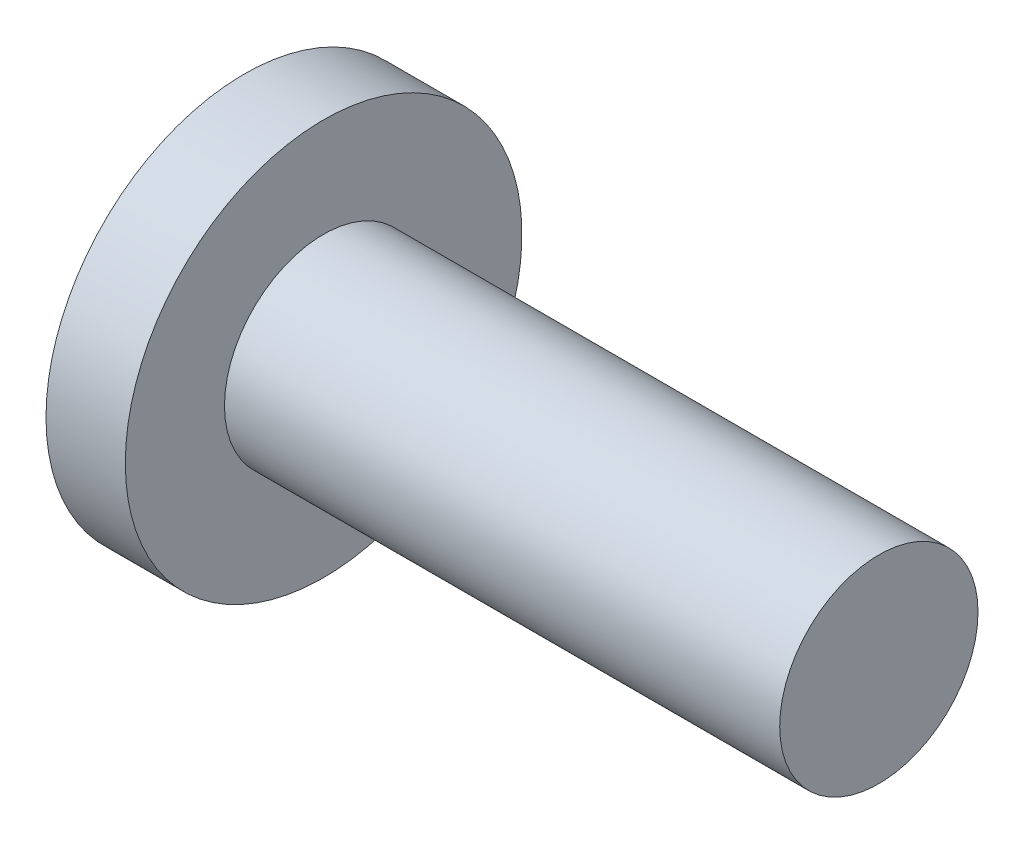
ISO-10303-21;
HEADER;
FILE_DESCRIPTION(('STEP AP214'),'2;1');
FILE_NAME('part.step','',(''),(''),'','','');
FILE_SCHEMA(('AUTOMOTIVE_DESIGN { 1 0 10303 214 1 1 1 1 }'));
ENDSEC;
DATA;
#1=APPLICATION_CONTEXT('core data for automotive mechanical design processes');
#2=APPLICATION_PROTOCOL_DEFINITION('international standard','automotive_design',2000,#1);
#3=PRODUCT_CONTEXT('',#1,'mechanical');
#4=PRODUCT('Part','Part','',(#3));
#5=PRODUCT_RELATED_PRODUCT_CATEGORY('part','',(#4));
#6=PRODUCT_DEFINITION_FORMATION('','',#4);
#7=PRODUCT_DEFINITION_CONTEXT('part definition',#1,'design');
#8=PRODUCT_DEFINITION('design','',#6,#7);
#9=PRODUCT_DEFINITION_SHAPE('','',#8);
#10=(LENGTH_UNIT() NAMED_UNIT(*) SI_UNIT(.MILLI.,.METRE.));
#11=(NAMED_UNIT(*) PLANE_ANGLE_UNIT() SI_UNIT($,.RADIAN.));
#12=(NAMED_UNIT(*) SI_UNIT($,.STERADIAN.) SOLID_ANGLE_UNIT());
#13=UNCERTAINTY_MEASURE_WITH_UNIT(LENGTH_MEASURE(1.E-05),#10,'distance_accuracy_value','');
#14=(GEOMETRIC_REPRESENTATION_CONTEXT(3) GLOBAL_UNCERTAINTY_ASSIGNED_CONTEXT((#13)) GLOBAL_UNIT_ASSIGNED_CONTEXT((#10,
#11,#12)) REPRESENTATION_CONTEXT('',''));
#15=CARTESIAN_POINT('',(0.,0.,0.));
#16=DIRECTION('',(0.,0.,1.));
#17=DIRECTION('',(1.,0.,0.));
#18=AXIS2_PLACEMENT_3D('',#15,#16,#17);
#19=CARTESIAN_POINT('',(3.04545454545419,0.,0.));
#20=DIRECTION('',(1.,0.,0.));
#21=DIRECTION('',(0.,0.,-1.));
#22=AXIS2_PLACEMENT_3D('',#19,#20,#21);
#23=PLANE('',#22);
#24=CARTESIAN_POINT('',(3.04545454545419,0.,0.));
#25=DIRECTION('',(-1.,0.,0.));
#26=DIRECTION('',(0.,0.,1.));
#27=AXIS2_PLACEMENT_3D('',#24,#25,#26);
#28=CIRCLE('',#27,2.5000000000003);
#29=CARTESIAN_POINT('',(3.04545454545419,0.,2.5000000000003));
#30=VERTEX_POINT('',#29);
#31=EDGE_CURVE('E11',#30,#30,#28,.T.);
#32=ORIENTED_EDGE('',*,*,#31,.T.);
#33=EDGE_LOOP('',(#32));
#34=FACE_BOUND('',#33,.T.);
#35=ADVANCED_FACE('F41',(#34),#23,.F.);
#36=CARTESIAN_POINT('',(-108.492709855054,0.,0.));
#37=DIRECTION('',(-1.,0.,0.));
#38=DIRECTION('',(0.,0.,1.));
#39=AXIS2_PLACEMENT_3D('',#36,#37,#38);
#40=CYLINDRICAL_SURFACE('',#39,2.50000000000015);
#41=ORIENTED_EDGE('',*,*,#31,.F.);
#42=EDGE_LOOP('',(#41));
#43=FACE_BOUND('',#42,.T.);
#44=CARTESIAN_POINT('',(4.04545454545419,0.,0.));
#45=DIRECTION('',(-1.,0.,0.));
#46=DIRECTION('',(0.,0.,1.));
#47=AXIS2_PLACEMENT_3D('',#44,#45,#46);
#48=CIRCLE('',#47,2.5);
#49=CARTESIAN_POINT('',(4.04545454545419,0.,2.5));
#50=VERTEX_POINT('',#49);
#51=EDGE_CURVE('E50',#50,#50,#48,.T.);
#52=ORIENTED_EDGE('',*,*,#51,.T.);
#53=EDGE_LOOP('',(#52));
#54=FACE_BOUND('',#53,.T.);
#55=ADVANCED_FACE('F71',(#43,#54),#40,.T.);
#56=CARTESIAN_POINT('',(4.04545454545419,2.5,0.));
#57=DIRECTION('',(-1.,0.,0.));
#58=DIRECTION('',(0.,0.,1.));
#59=AXIS2_PLACEMENT_3D('',#56,#57,#58);
#60=PLANE('',#59);
#61=ORIENTED_EDGE('',*,*,#51,.F.);
#62=EDGE_LOOP('',(#61));
#63=FACE_BOUND('',#62,.T.);
#64=CARTESIAN_POINT('',(4.04545454545419,0.,0.));
#65=DIRECTION('',(-1.,0.,0.));
#66=DIRECTION('',(0.,0.,1.));
#67=AXIS2_PLACEMENT_3D('',#64,#65,#66);
#68=CIRCLE('',#67,1.25);
#69=CARTESIAN_POINT('',(4.04545454545419,0.,1.25));
#70=VERTEX_POINT('',#69);
#71=EDGE_CURVE('E51',#70,#70,#68,.T.);
#72=ORIENTED_EDGE('',*,*,#71,.T.);
#73=EDGE_LOOP('',(#72));
#74=FACE_BOUND('',#73,.T.);
#75=ADVANCED_FACE('F67',(#63,#74),#60,.F.);
#76=CARTESIAN_POINT('',(-108.492709855054,0.,0.));
#77=DIRECTION('',(-1.,0.,0.));
#78=DIRECTION('',(0.,0.,1.));
#79=AXIS2_PLACEMENT_3D('',#76,#77,#78);
#80=CYLINDRICAL_SURFACE('',#79,1.25);
#81=ORIENTED_EDGE('',*,*,#71,.F.);
#82=EDGE_LOOP('',(#81));
#83=FACE_BOUND('',#82,.T.);
#84=CARTESIAN_POINT('',(11.0454545454542,0.,0.));
#85=DIRECTION('',(-1.,0.,0.));
#86=DIRECTION('',(0.,0.,1.));
#87=AXIS2_PLACEMENT_3D('',#84,#85,#86);
#88=CIRCLE('',#87,1.25);
#89=CARTESIAN_POINT('',(11.0454545454542,0.,1.25));
#90=VERTEX_POINT('',#89);
#91=EDGE_CURVE('E54',#90,#90,#88,.T.);
#92=ORIENTED_EDGE('',*,*,#91,.T.);
#93=EDGE_LOOP('',(#92));
#94=FACE_BOUND('',#93,.T.);
#95=ADVANCED_FACE('F62',(#83,#94),#80,.T.);
#96=CARTESIAN_POINT('',(11.0454545454542,1.25,0.));
#97=DIRECTION('',(-1.,0.,0.));
#98=DIRECTION('',(0.,0.,1.));
#99=AXIS2_PLACEMENT_3D('',#96,#97,#98);
#100=PLANE('',#99);
#101=ORIENTED_EDGE('',*,*,#91,.F.);
#102=EDGE_LOOP('',(#101));
#103=FACE_BOUND('',#102,.T.);
#104=ADVANCED_FACE('F64',(#103),#100,.F.);
#105=CLOSED_SHELL('',(#35,#55,#75,#95,#104));
#106=MANIFOLD_SOLID_BREP('B2',#105);
#107=ADVANCED_BREP_SHAPE_REPRESENTATION('',(#18,#106),#14);
#108=SHAPE_DEFINITION_REPRESENTATION(#9,#107);
ENDSEC;
END-ISO-10303-21;
